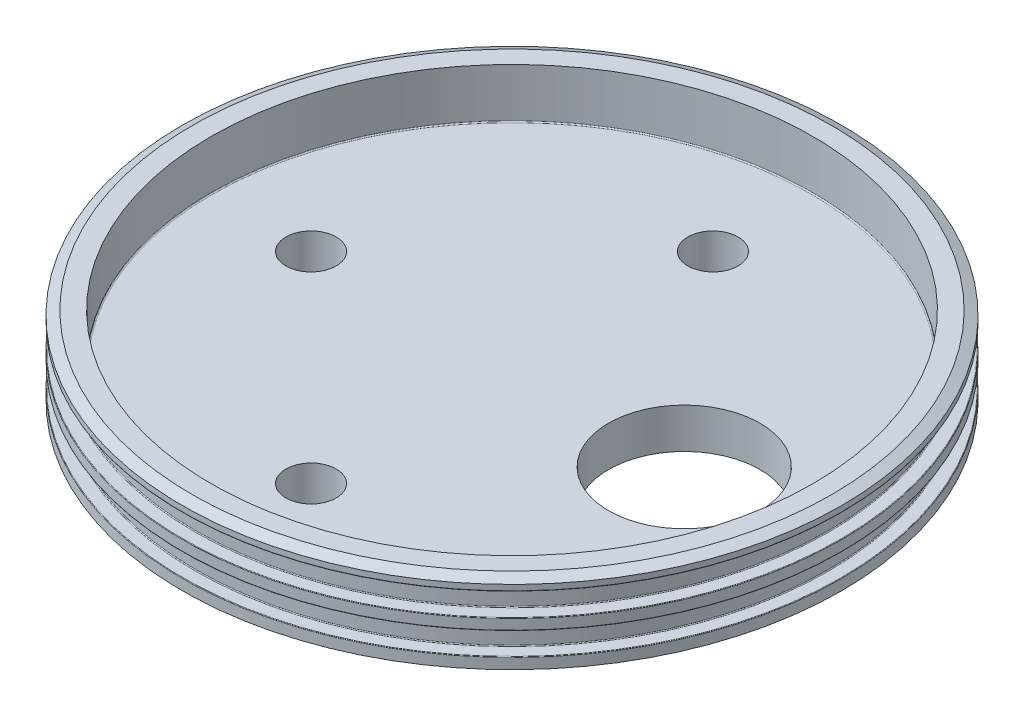
ISO-10303-21;
HEADER;
FILE_DESCRIPTION(('STEP AP214'),'2;1');
FILE_NAME('part.step','',(''),(''),'','','');
FILE_SCHEMA(('AUTOMOTIVE_DESIGN { 1 0 10303 214 1 1 1 1 }'));
ENDSEC;
DATA;
#1=APPLICATION_CONTEXT('core data for automotive mechanical design processes');
#2=APPLICATION_PROTOCOL_DEFINITION('international standard','automotive_design',2000,#1);
#3=PRODUCT_CONTEXT('',#1,'mechanical');
#4=PRODUCT('Part','Part','',(#3));
#5=PRODUCT_RELATED_PRODUCT_CATEGORY('part','',(#4));
#6=PRODUCT_DEFINITION_FORMATION('','',#4);
#7=PRODUCT_DEFINITION_CONTEXT('part definition',#1,'design');
#8=PRODUCT_DEFINITION('design','',#6,#7);
#9=PRODUCT_DEFINITION_SHAPE('','',#8);
#10=(LENGTH_UNIT() NAMED_UNIT(*) SI_UNIT(.MILLI.,.METRE.));
#11=(NAMED_UNIT(*) PLANE_ANGLE_UNIT() SI_UNIT($,.RADIAN.));
#12=(NAMED_UNIT(*) SI_UNIT($,.STERADIAN.) SOLID_ANGLE_UNIT());
#13=UNCERTAINTY_MEASURE_WITH_UNIT(LENGTH_MEASURE(1.E-05),#10,'distance_accuracy_value','');
#14=(GEOMETRIC_REPRESENTATION_CONTEXT(3) GLOBAL_UNCERTAINTY_ASSIGNED_CONTEXT((#13)) GLOBAL_UNIT_ASSIGNED_CONTEXT((#10,
#11,#12)) REPRESENTATION_CONTEXT('',''));
#15=CARTESIAN_POINT('',(0.,0.,0.));
#16=DIRECTION('',(0.,0.,1.));
#17=DIRECTION('',(1.,0.,0.));
#18=AXIS2_PLACEMENT_3D('',#15,#16,#17);
#19=CARTESIAN_POINT('',(0.,0.,0.));
#20=DIRECTION('',(0.,1.,0.));
#21=DIRECTION('',(-1.,0.,0.));
#22=AXIS2_PLACEMENT_3D('',#19,#20,#21);
#23=PLANE('',#22);
#24=CARTESIAN_POINT('',(0.,0.,0.));
#25=DIRECTION('',(0.,1.,0.));
#26=DIRECTION('',(-1.,0.,0.));
#27=AXIS2_PLACEMENT_3D('',#24,#25,#26);
#28=CIRCLE('',#27,66.2178);
#29=CARTESIAN_POINT('',(-66.2178,0.,0.));
#30=VERTEX_POINT('',#29);
#31=EDGE_CURVE('E141',#30,#30,#28,.T.);
#32=ORIENTED_EDGE('',*,*,#31,.T.);
#33=EDGE_LOOP('',(#32));
#34=FACE_BOUND('',#33,.T.);
#35=CARTESIAN_POINT('',(0.,0.,0.));
#36=DIRECTION('',(0.,1.,0.));
#37=DIRECTION('',(-1.,0.,0.));
#38=AXIS2_PLACEMENT_3D('',#35,#36,#37);
#39=CIRCLE('',#38,72.898);
#40=CARTESIAN_POINT('',(-72.898,0.,0.));
#41=VERTEX_POINT('',#40);
#42=EDGE_CURVE('E149',#41,#41,#39,.T.);
#43=ORIENTED_EDGE('',*,*,#42,.F.);
#44=EDGE_LOOP('',(#43));
#45=FACE_BOUND('',#44,.T.);
#46=ADVANCED_FACE('F45',(#34,#45),#23,.F.);
#47=CARTESIAN_POINT('',(0.,48.1922132313012,0.));
#48=DIRECTION('',(0.,1.,0.));
#49=DIRECTION('',(-1.,0.,0.));
#50=AXIS2_PLACEMENT_3D('',#47,#48,#49);
#51=CYLINDRICAL_SURFACE('',#50,72.898);
#52=CARTESIAN_POINT('',(0.,2.33679999999999,0.));
#53=DIRECTION('',(0.,-1.,0.));
#54=DIRECTION('',(1.,0.,0.));
#55=AXIS2_PLACEMENT_3D('',#52,#53,#54);
#56=CIRCLE('',#55,72.898);
#57=CARTESIAN_POINT('',(72.898,2.3368,0.));
#58=VERTEX_POINT('',#57);
#59=EDGE_CURVE('E69',#58,#58,#56,.T.);
#60=ORIENTED_EDGE('',*,*,#59,.T.);
#61=EDGE_LOOP('',(#60));
#62=FACE_BOUND('',#61,.T.);
#63=ORIENTED_EDGE('',*,*,#42,.T.);
#64=EDGE_LOOP('',(#63));
#65=FACE_BOUND('',#64,.T.);
#66=ADVANCED_FACE('F229',(#62,#65),#51,.T.);
#67=CARTESIAN_POINT('',(72.898,2.4638,0.));
#68=DIRECTION('',(0.,-1.,0.));
#69=DIRECTION('',(1.,0.,0.));
#70=AXIS2_PLACEMENT_3D('',#67,#68,#69);
#71=PLANE('',#70);
#72=CARTESIAN_POINT('',(0.,2.46379999999999,0.));
#73=DIRECTION('',(0.,-1.,0.));
#74=DIRECTION('',(1.,0.,0.));
#75=AXIS2_PLACEMENT_3D('',#72,#73,#74);
#76=CIRCLE('',#75,72.771);
#77=CARTESIAN_POINT('',(72.771,2.4638,0.));
#78=VERTEX_POINT('',#77);
#79=EDGE_CURVE('E73',#78,#78,#76,.F.);
#80=ORIENTED_EDGE('',*,*,#79,.T.);
#81=EDGE_LOOP('',(#80));
#82=FACE_BOUND('',#81,.T.);
#83=CARTESIAN_POINT('',(0.,2.46379999999999,0.));
#84=DIRECTION('',(0.,-1.,0.));
#85=DIRECTION('',(1.,0.,0.));
#86=AXIS2_PLACEMENT_3D('',#83,#84,#85);
#87=CIRCLE('',#86,70.1548);
#88=CARTESIAN_POINT('',(70.1548,2.4638,0.));
#89=VERTEX_POINT('',#88);
#90=EDGE_CURVE('E109',#89,#89,#87,.T.);
#91=ORIENTED_EDGE('',*,*,#90,.T.);
#92=EDGE_LOOP('',(#91));
#93=FACE_BOUND('',#92,.T.);
#94=ADVANCED_FACE('F236',(#82,#93),#71,.F.);
#95=CARTESIAN_POINT('',(0.,48.1922132313012,0.));
#96=DIRECTION('',(0.,1.,0.));
#97=DIRECTION('',(-1.,0.,0.));
#98=AXIS2_PLACEMENT_3D('',#95,#96,#97);
#99=CYLINDRICAL_SURFACE('',#98,69.977);
#100=CARTESIAN_POINT('',(0.,7.26439999999999,0.));
#101=DIRECTION('',(0.,1.,0.));
#102=DIRECTION('',(-1.,0.,0.));
#103=AXIS2_PLACEMENT_3D('',#100,#101,#102);
#104=CIRCLE('',#103,69.977);
#105=CARTESIAN_POINT('',(-69.977,7.26439999999998,0.));
#106=VERTEX_POINT('',#105);
#107=EDGE_CURVE('E113',#106,#106,#104,.F.);
#108=ORIENTED_EDGE('',*,*,#107,.T.);
#109=EDGE_LOOP('',(#108));
#110=FACE_BOUND('',#109,.T.);
#111=CARTESIAN_POINT('',(0.,2.64159999999999,0.));
#112=DIRECTION('',(0.,-1.,0.));
#113=DIRECTION('',(1.,0.,0.));
#114=AXIS2_PLACEMENT_3D('',#111,#112,#113);
#115=CIRCLE('',#114,69.977);
#116=CARTESIAN_POINT('',(69.977,2.6416,0.));
#117=VERTEX_POINT('',#116);
#118=EDGE_CURVE('E117',#117,#117,#115,.F.);
#119=ORIENTED_EDGE('',*,*,#118,.T.);
#120=EDGE_LOOP('',(#119));
#121=FACE_BOUND('',#120,.T.);
#122=ADVANCED_FACE('F326',(#110,#121),#99,.T.);
#123=CARTESIAN_POINT('',(69.977,7.4422,0.));
#124=DIRECTION('',(0.,1.,0.));
#125=DIRECTION('',(-1.,0.,0.));
#126=AXIS2_PLACEMENT_3D('',#123,#124,#125);
#127=PLANE('',#126);
#128=CARTESIAN_POINT('',(0.,7.44219999999999,0.));
#129=DIRECTION('',(0.,1.,0.));
#130=DIRECTION('',(-1.,0.,0.));
#131=AXIS2_PLACEMENT_3D('',#128,#129,#130);
#132=CIRCLE('',#131,72.771);
#133=CARTESIAN_POINT('',(-72.771,7.44219999999998,0.));
#134=VERTEX_POINT('',#133);
#135=EDGE_CURVE('E77',#134,#134,#132,.F.);
#136=ORIENTED_EDGE('',*,*,#135,.T.);
#137=EDGE_LOOP('',(#136));
#138=FACE_BOUND('',#137,.T.);
#139=CARTESIAN_POINT('',(0.,7.44219999999999,0.));
#140=DIRECTION('',(0.,1.,0.));
#141=DIRECTION('',(-1.,0.,0.));
#142=AXIS2_PLACEMENT_3D('',#139,#140,#141);
#143=CIRCLE('',#142,70.1548);
#144=CARTESIAN_POINT('',(-70.1548,7.44219999999998,0.));
#145=VERTEX_POINT('',#144);
#146=EDGE_CURVE('E121',#145,#145,#143,.T.);
#147=ORIENTED_EDGE('',*,*,#146,.T.);
#148=EDGE_LOOP('',(#147));
#149=FACE_BOUND('',#148,.T.);
#150=ADVANCED_FACE('F322',(#138,#149),#127,.F.);
#151=CARTESIAN_POINT('',(0.,48.1922132313012,0.));
#152=DIRECTION('',(0.,1.,0.));
#153=DIRECTION('',(-1.,0.,0.));
#154=AXIS2_PLACEMENT_3D('',#151,#152,#153);
#155=CYLINDRICAL_SURFACE('',#154,72.898);
#156=CARTESIAN_POINT('',(0.,9.77899999999999,0.));
#157=DIRECTION('',(0.,-1.,0.));
#158=DIRECTION('',(1.,0.,0.));
#159=AXIS2_PLACEMENT_3D('',#156,#157,#158);
#160=CIRCLE('',#159,72.898);
#161=CARTESIAN_POINT('',(72.898,9.779,0.));
#162=VERTEX_POINT('',#161);
#163=EDGE_CURVE('E81',#162,#162,#160,.T.);
#164=ORIENTED_EDGE('',*,*,#163,.T.);
#165=EDGE_LOOP('',(#164));
#166=FACE_BOUND('',#165,.T.);
#167=CARTESIAN_POINT('',(0.,7.56919999999999,0.));
#168=DIRECTION('',(0.,1.,0.));
#169=DIRECTION('',(-1.,0.,0.));
#170=AXIS2_PLACEMENT_3D('',#167,#168,#169);
#171=CIRCLE('',#170,72.898);
#172=CARTESIAN_POINT('',(-72.898,7.56919999999998,0.));
#173=VERTEX_POINT('',#172);
#174=EDGE_CURVE('E85',#173,#173,#171,.T.);
#175=ORIENTED_EDGE('',*,*,#174,.T.);
#176=EDGE_LOOP('',(#175));
#177=FACE_BOUND('',#176,.T.);
#178=ADVANCED_FACE('F318',(#166,#177),#155,.T.);
#179=CARTESIAN_POINT('',(72.898,9.906,0.));
#180=DIRECTION('',(0.,-1.,0.));
#181=DIRECTION('',(1.,0.,0.));
#182=AXIS2_PLACEMENT_3D('',#179,#180,#181);
#183=PLANE('',#182);
#184=CARTESIAN_POINT('',(0.,9.90599999999999,0.));
#185=DIRECTION('',(0.,-1.,0.));
#186=DIRECTION('',(1.,0.,0.));
#187=AXIS2_PLACEMENT_3D('',#184,#185,#186);
#188=CIRCLE('',#187,72.771);
#189=CARTESIAN_POINT('',(72.771,9.906,0.));
#190=VERTEX_POINT('',#189);
#191=EDGE_CURVE('E89',#190,#190,#188,.F.);
#192=ORIENTED_EDGE('',*,*,#191,.T.);
#193=EDGE_LOOP('',(#192));
#194=FACE_BOUND('',#193,.T.);
#195=CARTESIAN_POINT('',(0.,9.90599999999999,0.));
#196=DIRECTION('',(0.,-1.,0.));
#197=DIRECTION('',(1.,0.,0.));
#198=AXIS2_PLACEMENT_3D('',#195,#196,#197);
#199=CIRCLE('',#198,70.1548);
#200=CARTESIAN_POINT('',(70.1548,9.906,0.));
#201=VERTEX_POINT('',#200);
#202=EDGE_CURVE('E125',#201,#201,#199,.T.);
#203=ORIENTED_EDGE('',*,*,#202,.T.);
#204=EDGE_LOOP('',(#203));
#205=FACE_BOUND('',#204,.T.);
#206=ADVANCED_FACE('F314',(#194,#205),#183,.F.);
#207=CARTESIAN_POINT('',(0.,48.1922132313012,0.));
#208=DIRECTION('',(0.,1.,0.));
#209=DIRECTION('',(-1.,0.,0.));
#210=AXIS2_PLACEMENT_3D('',#207,#208,#209);
#211=CYLINDRICAL_SURFACE('',#210,69.977);
#212=CARTESIAN_POINT('',(0.,14.8082,0.));
#213=DIRECTION('',(0.,1.,0.));
#214=DIRECTION('',(-1.,0.,0.));
#215=AXIS2_PLACEMENT_3D('',#212,#213,#214);
#216=CIRCLE('',#215,69.977);
#217=CARTESIAN_POINT('',(-69.977,14.8082,0.));
#218=VERTEX_POINT('',#217);
#219=EDGE_CURVE('E129',#218,#218,#216,.F.);
#220=ORIENTED_EDGE('',*,*,#219,.T.);
#221=EDGE_LOOP('',(#220));
#222=FACE_BOUND('',#221,.T.);
#223=CARTESIAN_POINT('',(0.,10.0838,0.));
#224=DIRECTION('',(0.,-1.,0.));
#225=DIRECTION('',(1.,0.,0.));
#226=AXIS2_PLACEMENT_3D('',#223,#224,#225);
#227=CIRCLE('',#226,69.977);
#228=CARTESIAN_POINT('',(69.977,10.0838,0.));
#229=VERTEX_POINT('',#228);
#230=EDGE_CURVE('E133',#229,#229,#227,.F.);
#231=ORIENTED_EDGE('',*,*,#230,.T.);
#232=EDGE_LOOP('',(#231));
#233=FACE_BOUND('',#232,.T.);
#234=ADVANCED_FACE('F310',(#222,#233),#211,.T.);
#235=CARTESIAN_POINT('',(69.977,14.986,0.));
#236=DIRECTION('',(0.,1.,0.));
#237=DIRECTION('',(-1.,0.,0.));
#238=AXIS2_PLACEMENT_3D('',#235,#236,#237);
#239=PLANE('',#238);
#240=CARTESIAN_POINT('',(0.,14.986,0.));
#241=DIRECTION('',(0.,1.,0.));
#242=DIRECTION('',(-1.,0.,0.));
#243=AXIS2_PLACEMENT_3D('',#240,#241,#242);
#244=CIRCLE('',#243,72.771);
#245=CARTESIAN_POINT('',(-72.771,14.986,0.));
#246=VERTEX_POINT('',#245);
#247=EDGE_CURVE('E93',#246,#246,#244,.F.);
#248=ORIENTED_EDGE('',*,*,#247,.T.);
#249=EDGE_LOOP('',(#248));
#250=FACE_BOUND('',#249,.T.);
#251=CARTESIAN_POINT('',(0.,14.986,0.));
#252=DIRECTION('',(0.,1.,0.));
#253=DIRECTION('',(-1.,0.,0.));
#254=AXIS2_PLACEMENT_3D('',#251,#252,#253);
#255=CIRCLE('',#254,70.1548);
#256=CARTESIAN_POINT('',(-70.1548,14.986,0.));
#257=VERTEX_POINT('',#256);
#258=EDGE_CURVE('E137',#257,#257,#255,.T.);
#259=ORIENTED_EDGE('',*,*,#258,.T.);
#260=EDGE_LOOP('',(#259));
#261=FACE_BOUND('',#260,.T.);
#262=ADVANCED_FACE('F304',(#250,#261),#239,.F.);
#263=CARTESIAN_POINT('',(0.,48.1922132313012,0.));
#264=DIRECTION('',(0.,1.,0.));
#265=DIRECTION('',(-1.,0.,0.));
#266=AXIS2_PLACEMENT_3D('',#263,#264,#265);
#267=CYLINDRICAL_SURFACE('',#266,72.898);
#268=CARTESIAN_POINT('',(0.,16.3322,0.));
#269=DIRECTION('',(0.,-1.,0.));
#270=DIRECTION('',(1.,0.,0.));
#271=AXIS2_PLACEMENT_3D('',#268,#269,#270);
#272=CIRCLE('',#271,72.898);
#273=CARTESIAN_POINT('',(72.898,16.3322,0.));
#274=VERTEX_POINT('',#273);
#275=EDGE_CURVE('E58',#274,#274,#272,.T.);
#276=ORIENTED_EDGE('',*,*,#275,.T.);
#277=EDGE_LOOP('',(#276));
#278=FACE_BOUND('',#277,.T.);
#279=CARTESIAN_POINT('',(0.,15.113,0.));
#280=DIRECTION('',(0.,1.,0.));
#281=DIRECTION('',(-1.,0.,0.));
#282=AXIS2_PLACEMENT_3D('',#279,#280,#281);
#283=CIRCLE('',#282,72.898);
#284=CARTESIAN_POINT('',(-72.898,15.113,0.));
#285=VERTEX_POINT('',#284);
#286=EDGE_CURVE('E97',#285,#285,#283,.T.);
#287=ORIENTED_EDGE('',*,*,#286,.T.);
#288=EDGE_LOOP('',(#287));
#289=FACE_BOUND('',#288,.T.);
#290=ADVANCED_FACE('F297',(#278,#289),#267,.T.);
#291=CARTESIAN_POINT('',(72.898,17.3482,0.));
#292=DIRECTION('',(0.,-1.,0.));
#293=DIRECTION('',(1.,0.,0.));
#294=AXIS2_PLACEMENT_3D('',#291,#292,#293);
#295=PLANE('',#294);
#296=CARTESIAN_POINT('',(0.,17.3482,0.));
#297=DIRECTION('',(0.,-1.,0.));
#298=DIRECTION('',(1.,0.,0.));
#299=AXIS2_PLACEMENT_3D('',#296,#297,#298);
#300=CIRCLE('',#299,70.7191809687623);
#301=CARTESIAN_POINT('',(70.7191809687623,17.3482,0.));
#302=VERTEX_POINT('',#301);
#303=EDGE_CURVE('E63',#302,#302,#300,.F.);
#304=ORIENTED_EDGE('',*,*,#303,.T.);
#305=EDGE_LOOP('',(#304));
#306=FACE_BOUND('',#305,.T.);
#307=CARTESIAN_POINT('',(0.,17.3482,0.));
#308=DIRECTION('',(0.,1.,0.));
#309=DIRECTION('',(-1.,0.,0.));
#310=AXIS2_PLACEMENT_3D('',#307,#308,#309);
#311=CIRCLE('',#310,66.548);
#312=CARTESIAN_POINT('',(-66.548,17.3482,0.));
#313=VERTEX_POINT('',#312);
#314=EDGE_CURVE('E153',#313,#313,#311,.T.);
#315=ORIENTED_EDGE('',*,*,#314,.F.);
#316=EDGE_LOOP('',(#315));
#317=FACE_BOUND('',#316,.T.);
#318=ADVANCED_FACE('F225',(#306,#317),#295,.F.);
#319=CARTESIAN_POINT('',(0.,48.1922132313012,0.));
#320=DIRECTION('',(0.,1.,0.));
#321=DIRECTION('',(-1.,0.,0.));
#322=AXIS2_PLACEMENT_3D('',#319,#320,#321);
#323=CYLINDRICAL_SURFACE('',#322,66.548);
#324=CARTESIAN_POINT('',(0.,6.604,0.));
#325=DIRECTION('',(0.,-1.,0.));
#326=DIRECTION('',(1.,0.,0.));
#327=AXIS2_PLACEMENT_3D('',#324,#325,#326);
#328=CIRCLE('',#327,66.548);
#329=CARTESIAN_POINT('',(66.548,6.60400000000001,0.));
#330=VERTEX_POINT('',#329);
#331=EDGE_CURVE('E10',#330,#330,#328,.T.);
#332=ORIENTED_EDGE('',*,*,#331,.T.);
#333=EDGE_LOOP('',(#332));
#334=FACE_BOUND('',#333,.T.);
#335=ORIENTED_EDGE('',*,*,#314,.T.);
#336=EDGE_LOOP('',(#335));
#337=FACE_BOUND('',#336,.T.);
#338=ADVANCED_FACE('F215',(#334,#337),#323,.F.);
#339=CARTESIAN_POINT('',(66.548,6.35,0.));
#340=DIRECTION('',(0.,-1.,0.));
#341=DIRECTION('',(1.,0.,0.));
#342=AXIS2_PLACEMENT_3D('',#339,#340,#341);
#343=PLANE('',#342);
#344=CARTESIAN_POINT('',(0.,6.34999999999999,44.45));
#345=DIRECTION('',(0.,-1.,0.));
#346=DIRECTION('',(1.,0.,0.));
#347=AXIS2_PLACEMENT_3D('',#344,#345,#346);
#348=CIRCLE('',#347,5.56259999999999);
#349=CARTESIAN_POINT('',(5.56259999999999,6.35,44.45));
#350=VERTEX_POINT('',#349);
#351=EDGE_CURVE('E181',#350,#350,#348,.T.);
#352=ORIENTED_EDGE('',*,*,#351,.T.);
#353=EDGE_LOOP('',(#352));
#354=FACE_BOUND('',#353,.T.);
#355=CARTESIAN_POINT('',(0.,6.34999999999999,-44.45));
#356=DIRECTION('',(0.,-1.,0.));
#357=DIRECTION('',(1.,0.,0.));
#358=AXIS2_PLACEMENT_3D('',#355,#356,#357);
#359=CIRCLE('',#358,5.5626);
#360=CARTESIAN_POINT('',(5.5626,6.35,-44.45));
#361=VERTEX_POINT('',#360);
#362=EDGE_CURVE('E173',#361,#361,#359,.T.);
#363=ORIENTED_EDGE('',*,*,#362,.T.);
#364=EDGE_LOOP('',(#363));
#365=FACE_BOUND('',#364,.T.);
#366=CARTESIAN_POINT('',(38.1,6.35,0.));
#367=DIRECTION('',(0.,-1.,0.));
#368=DIRECTION('',(1.,0.,0.));
#369=AXIS2_PLACEMENT_3D('',#366,#367,#368);
#370=CIRCLE('',#369,16.764);
#371=CARTESIAN_POINT('',(54.864,6.35,0.));
#372=VERTEX_POINT('',#371);
#373=EDGE_CURVE('E165',#372,#372,#370,.T.);
#374=ORIENTED_EDGE('',*,*,#373,.T.);
#375=EDGE_LOOP('',(#374));
#376=FACE_BOUND('',#375,.T.);
#377=CARTESIAN_POINT('',(0.,6.35,0.));
#378=DIRECTION('',(0.,-1.,0.));
#379=DIRECTION('',(1.,0.,0.));
#380=AXIS2_PLACEMENT_3D('',#377,#378,#379);
#381=CIRCLE('',#380,66.294);
#382=CARTESIAN_POINT('',(66.294,6.35,0.));
#383=VERTEX_POINT('',#382);
#384=EDGE_CURVE('E53',#383,#383,#381,.F.);
#385=ORIENTED_EDGE('',*,*,#384,.T.);
#386=EDGE_LOOP('',(#385));
#387=FACE_BOUND('',#386,.T.);
#388=CARTESIAN_POINT('',(-44.45,6.34999999999999,0.));
#389=DIRECTION('',(0.,1.,0.));
#390=DIRECTION('',(0.,0.,1.));
#391=AXIS2_PLACEMENT_3D('',#388,#389,#390);
#392=CIRCLE('',#391,5.56259999999999);
#393=CARTESIAN_POINT('',(-44.45,6.34999999999999,5.56259999999999));
#394=VERTEX_POINT('',#393);
#395=EDGE_CURVE('E161',#394,#394,#392,.T.);
#396=ORIENTED_EDGE('',*,*,#395,.F.);
#397=EDGE_LOOP('',(#396));
#398=FACE_BOUND('',#397,.T.);
#399=ADVANCED_FACE('F213',(#354,#365,#376,#387,#398),#343,.F.);
#400=CARTESIAN_POINT('',(0.,-2.54,0.));
#401=DIRECTION('',(0.,1.,0.));
#402=DIRECTION('',(-1.,0.,0.));
#403=AXIS2_PLACEMENT_3D('',#400,#401,#402);
#404=CYLINDRICAL_SURFACE('',#403,66.04);
#405=CARTESIAN_POINT('',(0.,-2.413,0.));
#406=DIRECTION('',(0.,-1.,0.));
#407=DIRECTION('',(1.,0.,0.));
#408=AXIS2_PLACEMENT_3D('',#405,#406,#407);
#409=CIRCLE('',#408,66.04);
#410=CARTESIAN_POINT('',(66.04,-2.41299999999999,0.));
#411=VERTEX_POINT('',#410);
#412=EDGE_CURVE('E101',#411,#411,#409,.F.);
#413=ORIENTED_EDGE('',*,*,#412,.T.);
#414=EDGE_LOOP('',(#413));
#415=FACE_BOUND('',#414,.T.);
#416=CARTESIAN_POINT('',(0.,-0.177800000000004,0.));
#417=DIRECTION('',(0.,1.,0.));
#418=DIRECTION('',(-1.,0.,0.));
#419=AXIS2_PLACEMENT_3D('',#416,#417,#418);
#420=CIRCLE('',#419,66.04);
#421=CARTESIAN_POINT('',(-66.04,-0.177800000000012,0.));
#422=VERTEX_POINT('',#421);
#423=EDGE_CURVE('E145',#422,#422,#420,.F.);
#424=ORIENTED_EDGE('',*,*,#423,.T.);
#425=EDGE_LOOP('',(#424));
#426=FACE_BOUND('',#425,.T.);
#427=ADVANCED_FACE('F197',(#415,#426),#404,.T.);
#428=CARTESIAN_POINT('',(0.,-2.54,0.));
#429=DIRECTION('',(0.,-1.,0.));
#430=DIRECTION('',(1.,0.,0.));
#431=AXIS2_PLACEMENT_3D('',#428,#429,#430);
#432=PLANE('',#431);
#433=CARTESIAN_POINT('',(0.,-2.54,44.45));
#434=DIRECTION('',(0.,-1.,0.));
#435=DIRECTION('',(0.,0.,-1.));
#436=AXIS2_PLACEMENT_3D('',#433,#434,#435);
#437=CIRCLE('',#436,5.56259999999999);
#438=CARTESIAN_POINT('',(0.,-2.54,38.8874));
#439=VERTEX_POINT('',#438);
#440=EDGE_CURVE('E185',#439,#439,#437,.T.);
#441=ORIENTED_EDGE('',*,*,#440,.F.);
#442=EDGE_LOOP('',(#441));
#443=FACE_BOUND('',#442,.T.);
#444=CARTESIAN_POINT('',(0.,-2.54,-44.45));
#445=DIRECTION('',(0.,-1.,0.));
#446=DIRECTION('',(0.,0.,-1.));
#447=AXIS2_PLACEMENT_3D('',#444,#445,#446);
#448=CIRCLE('',#447,5.5626);
#449=CARTESIAN_POINT('',(0.,-2.54,-50.0126));
#450=VERTEX_POINT('',#449);
#451=EDGE_CURVE('E177',#450,#450,#448,.T.);
#452=ORIENTED_EDGE('',*,*,#451,.F.);
#453=EDGE_LOOP('',(#452));
#454=FACE_BOUND('',#453,.T.);
#455=CARTESIAN_POINT('',(38.1,-2.54,0.));
#456=DIRECTION('',(0.,-1.,0.));
#457=DIRECTION('',(1.,0.,0.));
#458=AXIS2_PLACEMENT_3D('',#455,#456,#457);
#459=CIRCLE('',#458,16.764);
#460=CARTESIAN_POINT('',(54.864,-2.53999999999999,0.));
#461=VERTEX_POINT('',#460);
#462=EDGE_CURVE('E169',#461,#461,#459,.T.);
#463=ORIENTED_EDGE('',*,*,#462,.F.);
#464=EDGE_LOOP('',(#463));
#465=FACE_BOUND('',#464,.T.);
#466=CARTESIAN_POINT('',(0.,-2.54,0.));
#467=DIRECTION('',(0.,-1.,0.));
#468=DIRECTION('',(1.,0.,0.));
#469=AXIS2_PLACEMENT_3D('',#466,#467,#468);
#470=CIRCLE('',#469,65.913);
#471=CARTESIAN_POINT('',(65.913,-2.53999999999999,0.));
#472=VERTEX_POINT('',#471);
#473=EDGE_CURVE('E105',#472,#472,#470,.T.);
#474=ORIENTED_EDGE('',*,*,#473,.T.);
#475=EDGE_LOOP('',(#474));
#476=FACE_BOUND('',#475,.T.);
#477=CARTESIAN_POINT('',(-44.45,-2.54,0.));
#478=DIRECTION('',(0.,1.,0.));
#479=DIRECTION('',(0.,0.,1.));
#480=AXIS2_PLACEMENT_3D('',#477,#478,#479);
#481=CIRCLE('',#480,5.5626);
#482=CARTESIAN_POINT('',(-44.45,-2.54,5.5626));
#483=VERTEX_POINT('',#482);
#484=EDGE_CURVE('E157',#483,#483,#481,.T.);
#485=ORIENTED_EDGE('',*,*,#484,.T.);
#486=EDGE_LOOP('',(#485));
#487=FACE_BOUND('',#486,.T.);
#488=ADVANCED_FACE('F193',(#443,#454,#465,#476,#487),#432,.T.);
#489=CARTESIAN_POINT('',(-44.45,6.34999999999999,0.));
#490=DIRECTION('',(0.,1.,0.));
#491=DIRECTION('',(0.,0.,1.));
#492=AXIS2_PLACEMENT_3D('',#489,#490,#491);
#493=CYLINDRICAL_SURFACE('',#492,5.56259999999999);
#494=ORIENTED_EDGE('',*,*,#484,.F.);
#495=EDGE_LOOP('',(#494));
#496=FACE_BOUND('',#495,.T.);
#497=ORIENTED_EDGE('',*,*,#395,.T.);
#498=EDGE_LOOP('',(#497));
#499=FACE_BOUND('',#498,.T.);
#500=ADVANCED_FACE('F196',(#496,#499),#493,.F.);
#501=CARTESIAN_POINT('',(0.,-0.177800000000004,0.));
#502=DIRECTION('',(0.,1.,0.));
#503=DIRECTION('',(-1.,0.,0.));
#504=AXIS2_PLACEMENT_3D('',#501,#502,#503);
#505=TOROIDAL_SURFACE('',#504,66.2178,0.1778);
#506=ORIENTED_EDGE('',*,*,#31,.F.);
#507=EDGE_LOOP('',(#506));
#508=FACE_BOUND('',#507,.T.);
#509=ORIENTED_EDGE('',*,*,#423,.F.);
#510=EDGE_LOOP('',(#509));
#511=FACE_BOUND('',#510,.T.);
#512=ADVANCED_FACE('F209',(#508,#511),#505,.F.);
#513=CARTESIAN_POINT('',(0.,14.8082,0.));
#514=DIRECTION('',(0.,1.,0.));
#515=DIRECTION('',(-1.,0.,0.));
#516=AXIS2_PLACEMENT_3D('',#513,#514,#515);
#517=TOROIDAL_SURFACE('',#516,70.1548,0.1778);
#518=ORIENTED_EDGE('',*,*,#219,.F.);
#519=EDGE_LOOP('',(#518));
#520=FACE_BOUND('',#519,.T.);
#521=ORIENTED_EDGE('',*,*,#258,.F.);
#522=EDGE_LOOP('',(#521));
#523=FACE_BOUND('',#522,.T.);
#524=ADVANCED_FACE('F244',(#520,#523),#517,.F.);
#525=CARTESIAN_POINT('',(0.,10.0838,0.));
#526=DIRECTION('',(0.,-1.,0.));
#527=DIRECTION('',(1.,0.,0.));
#528=AXIS2_PLACEMENT_3D('',#525,#526,#527);
#529=TOROIDAL_SURFACE('',#528,70.1548,0.1778);
#530=ORIENTED_EDGE('',*,*,#202,.F.);
#531=EDGE_LOOP('',(#530));
#532=FACE_BOUND('',#531,.T.);
#533=ORIENTED_EDGE('',*,*,#230,.F.);
#534=EDGE_LOOP('',(#533));
#535=FACE_BOUND('',#534,.T.);
#536=ADVANCED_FACE('F248',(#532,#535),#529,.F.);
#537=CARTESIAN_POINT('',(0.,7.26439999999999,0.));
#538=DIRECTION('',(0.,1.,0.));
#539=DIRECTION('',(-1.,0.,0.));
#540=AXIS2_PLACEMENT_3D('',#537,#538,#539);
#541=TOROIDAL_SURFACE('',#540,70.1548,0.1778);
#542=ORIENTED_EDGE('',*,*,#107,.F.);
#543=EDGE_LOOP('',(#542));
#544=FACE_BOUND('',#543,.T.);
#545=ORIENTED_EDGE('',*,*,#146,.F.);
#546=EDGE_LOOP('',(#545));
#547=FACE_BOUND('',#546,.T.);
#548=ADVANCED_FACE('F252',(#544,#547),#541,.F.);
#549=CARTESIAN_POINT('',(0.,2.64159999999999,0.));
#550=DIRECTION('',(0.,-1.,0.));
#551=DIRECTION('',(1.,0.,0.));
#552=AXIS2_PLACEMENT_3D('',#549,#550,#551);
#553=TOROIDAL_SURFACE('',#552,70.1548,0.1778);
#554=ORIENTED_EDGE('',*,*,#90,.F.);
#555=EDGE_LOOP('',(#554));
#556=FACE_BOUND('',#555,.T.);
#557=ORIENTED_EDGE('',*,*,#118,.F.);
#558=EDGE_LOOP('',(#557));
#559=FACE_BOUND('',#558,.T.);
#560=ADVANCED_FACE('F256',(#556,#559),#553,.F.);
#561=CARTESIAN_POINT('',(0.,-2.413,0.));
#562=DIRECTION('',(0.,-1.,0.));
#563=DIRECTION('',(1.,0.,0.));
#564=AXIS2_PLACEMENT_3D('',#561,#562,#563);
#565=TOROIDAL_SURFACE('',#564,65.913,0.127);
#566=ORIENTED_EDGE('',*,*,#412,.F.);
#567=EDGE_LOOP('',(#566));
#568=FACE_BOUND('',#567,.T.);
#569=ORIENTED_EDGE('',*,*,#473,.F.);
#570=EDGE_LOOP('',(#569));
#571=FACE_BOUND('',#570,.T.);
#572=ADVANCED_FACE('F260',(#568,#571),#565,.T.);
#573=CARTESIAN_POINT('',(0.,15.113,0.));
#574=DIRECTION('',(0.,1.,0.));
#575=DIRECTION('',(-1.,0.,0.));
#576=AXIS2_PLACEMENT_3D('',#573,#574,#575);
#577=TOROIDAL_SURFACE('',#576,72.771,0.127);
#578=ORIENTED_EDGE('',*,*,#247,.F.);
#579=EDGE_LOOP('',(#578));
#580=FACE_BOUND('',#579,.T.);
#581=ORIENTED_EDGE('',*,*,#286,.F.);
#582=EDGE_LOOP('',(#581));
#583=FACE_BOUND('',#582,.T.);
#584=ADVANCED_FACE('F264',(#580,#583),#577,.T.);
#585=CARTESIAN_POINT('',(0.,9.77899999999999,0.));
#586=DIRECTION('',(0.,-1.,0.));
#587=DIRECTION('',(1.,0.,0.));
#588=AXIS2_PLACEMENT_3D('',#585,#586,#587);
#589=TOROIDAL_SURFACE('',#588,72.771,0.127);
#590=ORIENTED_EDGE('',*,*,#163,.F.);
#591=EDGE_LOOP('',(#590));
#592=FACE_BOUND('',#591,.T.);
#593=ORIENTED_EDGE('',*,*,#191,.F.);
#594=EDGE_LOOP('',(#593));
#595=FACE_BOUND('',#594,.T.);
#596=ADVANCED_FACE('F268',(#592,#595),#589,.T.);
#597=CARTESIAN_POINT('',(0.,7.56919999999999,0.));
#598=DIRECTION('',(0.,1.,0.));
#599=DIRECTION('',(-1.,0.,0.));
#600=AXIS2_PLACEMENT_3D('',#597,#598,#599);
#601=TOROIDAL_SURFACE('',#600,72.771,0.127);
#602=ORIENTED_EDGE('',*,*,#135,.F.);
#603=EDGE_LOOP('',(#602));
#604=FACE_BOUND('',#603,.T.);
#605=ORIENTED_EDGE('',*,*,#174,.F.);
#606=EDGE_LOOP('',(#605));
#607=FACE_BOUND('',#606,.T.);
#608=ADVANCED_FACE('F272',(#604,#607),#601,.T.);
#609=CARTESIAN_POINT('',(0.,2.33679999999999,0.));
#610=DIRECTION('',(0.,-1.,0.));
#611=DIRECTION('',(1.,0.,0.));
#612=AXIS2_PLACEMENT_3D('',#609,#610,#611);
#613=TOROIDAL_SURFACE('',#612,72.771,0.127);
#614=ORIENTED_EDGE('',*,*,#59,.F.);
#615=EDGE_LOOP('',(#614));
#616=FACE_BOUND('',#615,.T.);
#617=ORIENTED_EDGE('',*,*,#79,.F.);
#618=EDGE_LOOP('',(#617));
#619=FACE_BOUND('',#618,.T.);
#620=ADVANCED_FACE('F276',(#616,#619),#613,.T.);
#621=CARTESIAN_POINT('',(0.,17.3482,0.));
#622=DIRECTION('',(0.,-1.,0.));
#623=DIRECTION('',(1.,0.,0.));
#624=AXIS2_PLACEMENT_3D('',#621,#622,#623);
#625=CONICAL_SURFACE('',#624,70.7191809687623,1.13446401379632);
#626=ORIENTED_EDGE('',*,*,#275,.F.);
#627=EDGE_LOOP('',(#626));
#628=FACE_BOUND('',#627,.T.);
#629=ORIENTED_EDGE('',*,*,#303,.F.);
#630=EDGE_LOOP('',(#629));
#631=FACE_BOUND('',#630,.T.);
#632=ADVANCED_FACE('F279',(#628,#631),#625,.T.);
#633=CARTESIAN_POINT('',(0.,6.604,0.));
#634=DIRECTION('',(0.,-1.,0.));
#635=DIRECTION('',(1.,0.,0.));
#636=AXIS2_PLACEMENT_3D('',#633,#634,#635);
#637=TOROIDAL_SURFACE('',#636,66.294,0.254);
#638=ORIENTED_EDGE('',*,*,#331,.F.);
#639=EDGE_LOOP('',(#638));
#640=FACE_BOUND('',#639,.T.);
#641=ORIENTED_EDGE('',*,*,#384,.F.);
#642=EDGE_LOOP('',(#641));
#643=FACE_BOUND('',#642,.T.);
#644=ADVANCED_FACE('F47',(#640,#643),#637,.F.);
#645=CARTESIAN_POINT('',(38.1,17.3482,0.));
#646=DIRECTION('',(0.,-1.,0.));
#647=DIRECTION('',(1.,0.,0.));
#648=AXIS2_PLACEMENT_3D('',#645,#646,#647);
#649=CYLINDRICAL_SURFACE('',#648,16.764);
#650=ORIENTED_EDGE('',*,*,#462,.T.);
#651=EDGE_LOOP('',(#650));
#652=FACE_BOUND('',#651,.T.);
#653=ORIENTED_EDGE('',*,*,#373,.F.);
#654=EDGE_LOOP('',(#653));
#655=FACE_BOUND('',#654,.T.);
#656=ADVANCED_FACE('F290',(#652,#655),#649,.F.);
#657=CARTESIAN_POINT('',(0.,-2.54,-44.45));
#658=DIRECTION('',(0.,-1.,0.));
#659=DIRECTION('',(0.,0.,-1.));
#660=AXIS2_PLACEMENT_3D('',#657,#658,#659);
#661=CYLINDRICAL_SURFACE('',#660,5.5626);
#662=ORIENTED_EDGE('',*,*,#451,.T.);
#663=EDGE_LOOP('',(#662));
#664=FACE_BOUND('',#663,.T.);
#665=ORIENTED_EDGE('',*,*,#362,.F.);
#666=EDGE_LOOP('',(#665));
#667=FACE_BOUND('',#666,.T.);
#668=ADVANCED_FACE('F472',(#664,#667),#661,.F.);
#669=CARTESIAN_POINT('',(0.,-2.54,44.45));
#670=DIRECTION('',(0.,-1.,0.));
#671=DIRECTION('',(0.,0.,-1.));
#672=AXIS2_PLACEMENT_3D('',#669,#670,#671);
#673=CYLINDRICAL_SURFACE('',#672,5.56259999999999);
#674=ORIENTED_EDGE('',*,*,#440,.T.);
#675=EDGE_LOOP('',(#674));
#676=FACE_BOUND('',#675,.T.);
#677=ORIENTED_EDGE('',*,*,#351,.F.);
#678=EDGE_LOOP('',(#677));
#679=FACE_BOUND('',#678,.T.);
#680=ADVANCED_FACE('F190',(#676,#679),#673,.F.);
#681=CLOSED_SHELL('',(#46,#66,#94,#122,#150,#178,#206,#234,#262,#290,#318,#338,#399,#427,#488,
#500,#512,#524,#536,#548,#560,#572,#584,#596,#608,#620,#632,#644,#656,#668,#680));
#682=MANIFOLD_SOLID_BREP('B2',#681);
#683=ADVANCED_BREP_SHAPE_REPRESENTATION('',(#18,#682),#14);
#684=SHAPE_DEFINITION_REPRESENTATION(#9,#683);
ENDSEC;
END-ISO-10303-21;
